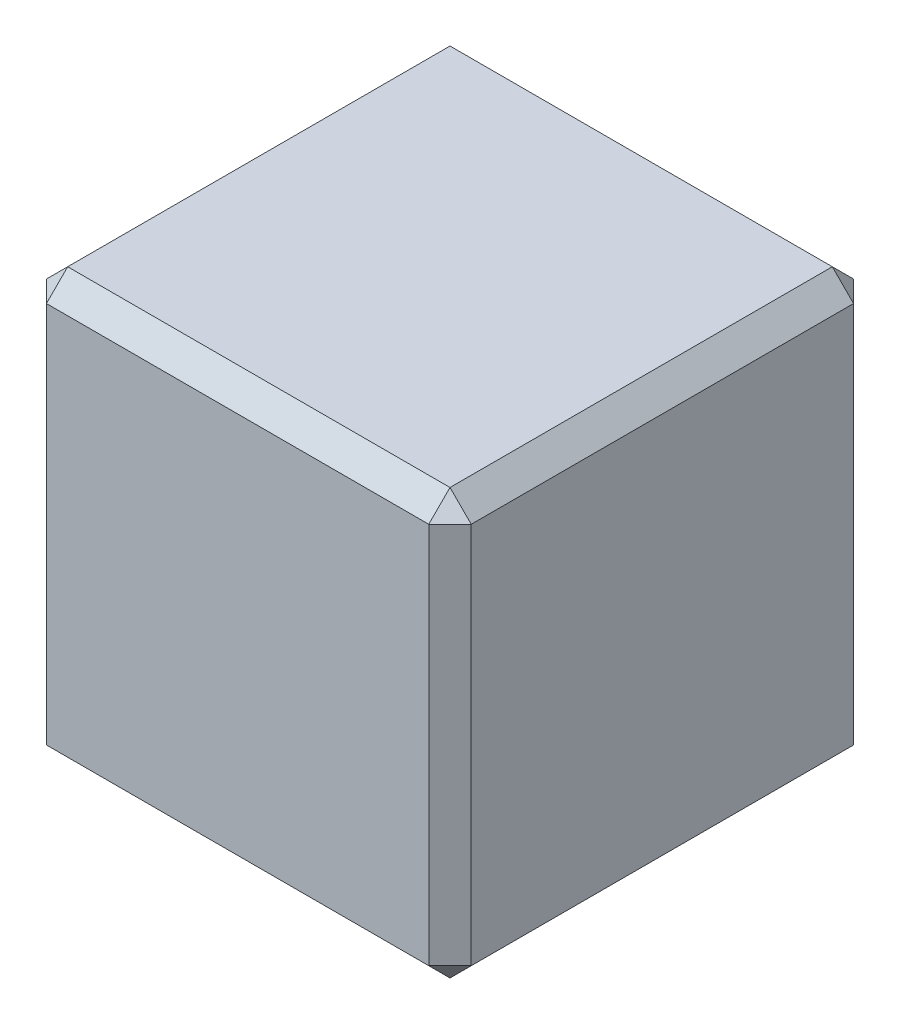
ISO-10303-21;
HEADER;
FILE_DESCRIPTION(('STEP AP214'),'2;1');
FILE_NAME('part.step','',(''),(''),'','','');
FILE_SCHEMA(('AUTOMOTIVE_DESIGN { 1 0 10303 214 1 1 1 1 }'));
ENDSEC;
DATA;
#1=APPLICATION_CONTEXT('core data for automotive mechanical design processes');
#2=APPLICATION_PROTOCOL_DEFINITION('international standard','automotive_design',2000,#1);
#3=PRODUCT_CONTEXT('',#1,'mechanical');
#4=PRODUCT('Part','Part','',(#3));
#5=PRODUCT_RELATED_PRODUCT_CATEGORY('part','',(#4));
#6=PRODUCT_DEFINITION_FORMATION('','',#4);
#7=PRODUCT_DEFINITION_CONTEXT('part definition',#1,'design');
#8=PRODUCT_DEFINITION('design','',#6,#7);
#9=PRODUCT_DEFINITION_SHAPE('','',#8);
#10=(LENGTH_UNIT() NAMED_UNIT(*) SI_UNIT(.MILLI.,.METRE.));
#11=(NAMED_UNIT(*) PLANE_ANGLE_UNIT() SI_UNIT($,.RADIAN.));
#12=(NAMED_UNIT(*) SI_UNIT($,.STERADIAN.) SOLID_ANGLE_UNIT());
#13=UNCERTAINTY_MEASURE_WITH_UNIT(LENGTH_MEASURE(1.E-05),#10,'distance_accuracy_value','');
#14=(GEOMETRIC_REPRESENTATION_CONTEXT(3) GLOBAL_UNCERTAINTY_ASSIGNED_CONTEXT((#13)) GLOBAL_UNIT_ASSIGNED_CONTEXT((#10,
#11,#12)) REPRESENTATION_CONTEXT('',''));
#15=CARTESIAN_POINT('',(0.,0.,0.));
#16=DIRECTION('',(0.,0.,1.));
#17=DIRECTION('',(1.,0.,0.));
#18=AXIS2_PLACEMENT_3D('',#15,#16,#17);
#19=CARTESIAN_POINT('',(0.,0.,20.));
#20=DIRECTION('',(1.,0.,0.));
#21=DIRECTION('',(0.,0.,-1.));
#22=AXIS2_PLACEMENT_3D('',#19,#20,#21);
#23=PLANE('',#22);
#24=DIRECTION('',(0.,-1.,0.));
#25=VECTOR('',#24,1.);
#26=CARTESIAN_POINT('',(0.,0.,0.999999999999997));
#27=LINE('',#26,#25);
#28=CARTESIAN_POINT('',(0.,19.,0.999999999999997));
#29=VERTEX_POINT('',#28);
#30=CARTESIAN_POINT('',(0.,1.,0.999999999999997));
#31=VERTEX_POINT('',#30);
#32=EDGE_CURVE('E175',#29,#31,#27,.T.);
#33=ORIENTED_EDGE('',*,*,#32,.T.);
#34=DIRECTION('',(0.,0.,1.));
#35=VECTOR('',#34,1.);
#36=CARTESIAN_POINT('',(0.,1.,20.));
#37=LINE('',#36,#35);
#38=CARTESIAN_POINT('',(0.,1.,19.));
#39=VERTEX_POINT('',#38);
#40=EDGE_CURVE('E177',#31,#39,#37,.T.);
#41=ORIENTED_EDGE('',*,*,#40,.T.);
#42=DIRECTION('',(0.,1.,0.));
#43=VECTOR('',#42,1.);
#44=CARTESIAN_POINT('',(0.,0.,19.));
#45=LINE('',#44,#43);
#46=CARTESIAN_POINT('',(0.,19.,19.));
#47=VERTEX_POINT('',#46);
#48=EDGE_CURVE('E173',#39,#47,#45,.T.);
#49=ORIENTED_EDGE('',*,*,#48,.T.);
#50=DIRECTION('',(0.,0.,-1.));
#51=VECTOR('',#50,1.);
#52=CARTESIAN_POINT('',(0.,19.,20.));
#53=LINE('',#52,#51);
#54=EDGE_CURVE('E171',#47,#29,#53,.T.);
#55=ORIENTED_EDGE('',*,*,#54,.T.);
#56=EDGE_LOOP('',(#33,#41,#49,#55));
#57=FACE_BOUND('',#56,.T.);
#58=ADVANCED_FACE('F38',(#57),#23,.F.);
#59=CARTESIAN_POINT('',(0.,0.,20.));
#60=DIRECTION('',(0.,1.,0.));
#61=DIRECTION('',(0.,0.,1.));
#62=AXIS2_PLACEMENT_3D('',#59,#60,#61);
#63=PLANE('',#62);
#64=DIRECTION('',(-1.,0.,0.));
#65=VECTOR('',#64,1.);
#66=CARTESIAN_POINT('',(0.,0.,19.));
#67=LINE('',#66,#65);
#68=CARTESIAN_POINT('',(19.,0.,19.));
#69=VERTEX_POINT('',#68);
#70=CARTESIAN_POINT('',(0.999999999999997,0.,19.));
#71=VERTEX_POINT('',#70);
#72=EDGE_CURVE('E131',#69,#71,#67,.T.);
#73=ORIENTED_EDGE('',*,*,#72,.T.);
#74=DIRECTION('',(0.,0.,-1.));
#75=VECTOR('',#74,1.);
#76=CARTESIAN_POINT('',(0.999999999999997,0.,20.));
#77=LINE('',#76,#75);
#78=CARTESIAN_POINT('',(0.999999999999997,0.,0.999999999999997));
#79=VERTEX_POINT('',#78);
#80=EDGE_CURVE('E169',#71,#79,#77,.T.);
#81=ORIENTED_EDGE('',*,*,#80,.T.);
#82=DIRECTION('',(1.,0.,0.));
#83=VECTOR('',#82,1.);
#84=CARTESIAN_POINT('',(20.,0.,0.999999999999997));
#85=LINE('',#84,#83);
#86=CARTESIAN_POINT('',(19.,0.,0.999999999999997));
#87=VERTEX_POINT('',#86);
#88=EDGE_CURVE('E134',#79,#87,#85,.T.);
#89=ORIENTED_EDGE('',*,*,#88,.T.);
#90=DIRECTION('',(0.,0.,1.));
#91=VECTOR('',#90,1.);
#92=CARTESIAN_POINT('',(19.,0.,20.));
#93=LINE('',#92,#91);
#94=EDGE_CURVE('E126',#87,#69,#93,.T.);
#95=ORIENTED_EDGE('',*,*,#94,.T.);
#96=EDGE_LOOP('',(#73,#81,#89,#95));
#97=FACE_BOUND('',#96,.T.);
#98=ADVANCED_FACE('F128',(#97),#63,.F.);
#99=CARTESIAN_POINT('',(20.,0.,20.));
#100=DIRECTION('',(-1.,0.,0.));
#101=DIRECTION('',(0.,0.,1.));
#102=AXIS2_PLACEMENT_3D('',#99,#100,#101);
#103=PLANE('',#102);
#104=DIRECTION('',(0.,-1.,0.));
#105=VECTOR('',#104,1.);
#106=CARTESIAN_POINT('',(20.,0.,19.));
#107=LINE('',#106,#105);
#108=CARTESIAN_POINT('',(20.,19.,19.));
#109=VERTEX_POINT('',#108);
#110=CARTESIAN_POINT('',(20.,0.999999999999997,19.));
#111=VERTEX_POINT('',#110);
#112=EDGE_CURVE('E191',#109,#111,#107,.T.);
#113=ORIENTED_EDGE('',*,*,#112,.T.);
#114=DIRECTION('',(0.,0.,-1.));
#115=VECTOR('',#114,1.);
#116=CARTESIAN_POINT('',(20.,0.999999999999997,20.));
#117=LINE('',#116,#115);
#118=CARTESIAN_POINT('',(20.,0.999999999999997,0.999999999999997));
#119=VERTEX_POINT('',#118);
#120=EDGE_CURVE('E145',#111,#119,#117,.T.);
#121=ORIENTED_EDGE('',*,*,#120,.T.);
#122=DIRECTION('',(0.,1.,0.));
#123=VECTOR('',#122,1.);
#124=CARTESIAN_POINT('',(20.,20.,0.999999999999997));
#125=LINE('',#124,#123);
#126=CARTESIAN_POINT('',(20.,19.,0.999999999999997));
#127=VERTEX_POINT('',#126);
#128=EDGE_CURVE('E193',#119,#127,#125,.T.);
#129=ORIENTED_EDGE('',*,*,#128,.T.);
#130=DIRECTION('',(0.,0.,1.));
#131=VECTOR('',#130,1.);
#132=CARTESIAN_POINT('',(20.,19.,20.));
#133=LINE('',#132,#131);
#134=EDGE_CURVE('E189',#127,#109,#133,.T.);
#135=ORIENTED_EDGE('',*,*,#134,.T.);
#136=EDGE_LOOP('',(#113,#121,#129,#135));
#137=FACE_BOUND('',#136,.T.);
#138=ADVANCED_FACE('F339',(#137),#103,.F.);
#139=CARTESIAN_POINT('',(0.,20.,20.));
#140=DIRECTION('',(0.,-1.,0.));
#141=DIRECTION('',(0.,0.,-1.));
#142=AXIS2_PLACEMENT_3D('',#139,#140,#141);
#143=PLANE('',#142);
#144=DIRECTION('',(1.,0.,0.));
#145=VECTOR('',#144,1.);
#146=CARTESIAN_POINT('',(0.,20.,19.));
#147=LINE('',#146,#145);
#148=CARTESIAN_POINT('',(0.999999999999997,20.,19.));
#149=VERTEX_POINT('',#148);
#150=CARTESIAN_POINT('',(19.,20.,19.));
#151=VERTEX_POINT('',#150);
#152=EDGE_CURVE('E48',#149,#151,#147,.T.);
#153=ORIENTED_EDGE('',*,*,#152,.T.);
#154=DIRECTION('',(0.,0.,-1.));
#155=VECTOR('',#154,1.);
#156=CARTESIAN_POINT('',(19.,20.,20.));
#157=LINE('',#156,#155);
#158=CARTESIAN_POINT('',(19.,20.,0.999999999999997));
#159=VERTEX_POINT('',#158);
#160=EDGE_CURVE('E11',#151,#159,#157,.T.);
#161=ORIENTED_EDGE('',*,*,#160,.T.);
#162=DIRECTION('',(-1.,0.,0.));
#163=VECTOR('',#162,1.);
#164=CARTESIAN_POINT('',(0.,20.,0.999999999999997));
#165=LINE('',#164,#163);
#166=CARTESIAN_POINT('',(0.999999999999997,20.,0.999999999999997));
#167=VERTEX_POINT('',#166);
#168=EDGE_CURVE('E205',#159,#167,#165,.T.);
#169=ORIENTED_EDGE('',*,*,#168,.T.);
#170=DIRECTION('',(0.,0.,1.));
#171=VECTOR('',#170,1.);
#172=CARTESIAN_POINT('',(0.999999999999997,20.,20.));
#173=LINE('',#172,#171);
#174=EDGE_CURVE('E59',#167,#149,#173,.T.);
#175=ORIENTED_EDGE('',*,*,#174,.T.);
#176=EDGE_LOOP('',(#153,#161,#169,#175));
#177=FACE_BOUND('',#176,.T.);
#178=ADVANCED_FACE('F278',(#177),#143,.F.);
#179=CARTESIAN_POINT('',(0.,0.,20.));
#180=DIRECTION('',(0.,0.,-1.));
#181=DIRECTION('',(-1.,0.,0.));
#182=AXIS2_PLACEMENT_3D('',#179,#180,#181);
#183=PLANE('',#182);
#184=DIRECTION('',(1.,0.,0.));
#185=VECTOR('',#184,1.);
#186=CARTESIAN_POINT('',(0.,0.999999999999997,20.));
#187=LINE('',#186,#185);
#188=CARTESIAN_POINT('',(0.999999999999997,0.999999999999997,20.));
#189=VERTEX_POINT('',#188);
#190=CARTESIAN_POINT('',(19.,0.999999999999997,20.));
#191=VERTEX_POINT('',#190);
#192=EDGE_CURVE('E200',#189,#191,#187,.T.);
#193=ORIENTED_EDGE('',*,*,#192,.T.);
#194=DIRECTION('',(0.,1.,0.));
#195=VECTOR('',#194,1.);
#196=CARTESIAN_POINT('',(19.,0.,20.));
#197=LINE('',#196,#195);
#198=CARTESIAN_POINT('',(19.,19.,20.));
#199=VERTEX_POINT('',#198);
#200=EDGE_CURVE('E202',#191,#199,#197,.T.);
#201=ORIENTED_EDGE('',*,*,#200,.T.);
#202=DIRECTION('',(-1.,0.,0.));
#203=VECTOR('',#202,1.);
#204=CARTESIAN_POINT('',(0.,19.,20.));
#205=LINE('',#204,#203);
#206=CARTESIAN_POINT('',(0.999999999999997,19.,20.));
#207=VERTEX_POINT('',#206);
#208=EDGE_CURVE('E196',#199,#207,#205,.T.);
#209=ORIENTED_EDGE('',*,*,#208,.T.);
#210=DIRECTION('',(0.,-1.,0.));
#211=VECTOR('',#210,1.);
#212=CARTESIAN_POINT('',(0.999999999999997,0.,20.));
#213=LINE('',#212,#211);
#214=EDGE_CURVE('E198',#207,#189,#213,.T.);
#215=ORIENTED_EDGE('',*,*,#214,.T.);
#216=EDGE_LOOP('',(#193,#201,#209,#215));
#217=FACE_BOUND('',#216,.T.);
#218=ADVANCED_FACE('F302',(#217),#183,.F.);
#219=CARTESIAN_POINT('',(0.,0.,0.));
#220=DIRECTION('',(0.,0.,-1.));
#221=DIRECTION('',(-1.,0.,0.));
#222=AXIS2_PLACEMENT_3D('',#219,#220,#221);
#223=PLANE('',#222);
#224=DIRECTION('',(0.,-1.,0.));
#225=VECTOR('',#224,1.);
#226=CARTESIAN_POINT('',(19.,0.,0.));
#227=LINE('',#226,#225);
#228=CARTESIAN_POINT('',(19.,19.,0.));
#229=VERTEX_POINT('',#228);
#230=CARTESIAN_POINT('',(19.,1.,0.));
#231=VERTEX_POINT('',#230);
#232=EDGE_CURVE('E182',#229,#231,#227,.T.);
#233=ORIENTED_EDGE('',*,*,#232,.T.);
#234=DIRECTION('',(-1.,0.,0.));
#235=VECTOR('',#234,1.);
#236=CARTESIAN_POINT('',(0.,1.,0.));
#237=LINE('',#236,#235);
#238=CARTESIAN_POINT('',(1.,1.,0.));
#239=VERTEX_POINT('',#238);
#240=EDGE_CURVE('E186',#231,#239,#237,.T.);
#241=ORIENTED_EDGE('',*,*,#240,.T.);
#242=DIRECTION('',(0.,1.,0.));
#243=VECTOR('',#242,1.);
#244=CARTESIAN_POINT('',(1.,20.,0.));
#245=LINE('',#244,#243);
#246=CARTESIAN_POINT('',(1.,19.,0.));
#247=VERTEX_POINT('',#246);
#248=EDGE_CURVE('E184',#239,#247,#245,.T.);
#249=ORIENTED_EDGE('',*,*,#248,.T.);
#250=DIRECTION('',(1.,0.,0.));
#251=VECTOR('',#250,1.);
#252=CARTESIAN_POINT('',(20.,19.,0.));
#253=LINE('',#252,#251);
#254=EDGE_CURVE('E180',#247,#229,#253,.T.);
#255=ORIENTED_EDGE('',*,*,#254,.T.);
#256=EDGE_LOOP('',(#233,#241,#249,#255));
#257=FACE_BOUND('',#256,.T.);
#258=ADVANCED_FACE('F271',(#257),#223,.T.);
#259=CARTESIAN_POINT('',(19.,20.,20.));
#260=DIRECTION('',(-0.70710678118655,-0.707106781186545,0.));
#261=DIRECTION('',(0.,0.,-1.));
#262=AXIS2_PLACEMENT_3D('',#259,#260,#261);
#263=PLANE('',#262);
#264=DIRECTION('',(0.707106781186545,-0.70710678118655,0.));
#265=VECTOR('',#264,1.);
#266=CARTESIAN_POINT('',(19.5,19.5,19.));
#267=LINE('',#266,#265);
#268=EDGE_CURVE('E43',#109,#151,#267,.F.);
#269=ORIENTED_EDGE('',*,*,#268,.F.);
#270=ORIENTED_EDGE('',*,*,#134,.F.);
#271=DIRECTION('',(-0.707106781186545,0.70710678118655,0.));
#272=VECTOR('',#271,1.);
#273=CARTESIAN_POINT('',(20.,19.,0.999999999999997));
#274=LINE('',#273,#272);
#275=EDGE_CURVE('E166',#159,#127,#274,.F.);
#276=ORIENTED_EDGE('',*,*,#275,.F.);
#277=ORIENTED_EDGE('',*,*,#160,.F.);
#278=EDGE_LOOP('',(#269,#270,#276,#277));
#279=FACE_BOUND('',#278,.T.);
#280=ADVANCED_FACE('F41',(#279),#263,.F.);
#281=CARTESIAN_POINT('',(19.,19.,20.));
#282=DIRECTION('',(0.57735026918963,0.577350269189622,0.577350269189626));
#283=DIRECTION('',(0.707106781186545,0.,-0.70710678118655));
#284=AXIS2_PLACEMENT_3D('',#281,#282,#283);
#285=PLANE('',#284);
#286=DIRECTION('',(-0.707106781186545,0.,0.70710678118655));
#287=VECTOR('',#286,1.);
#288=CARTESIAN_POINT('',(19.,19.,20.));
#289=LINE('',#288,#287);
#290=EDGE_CURVE('E251',#109,#199,#289,.T.);
#291=ORIENTED_EDGE('',*,*,#290,.F.);
#292=ORIENTED_EDGE('',*,*,#268,.T.);
#293=DIRECTION('',(0.,0.70710678118655,-0.707106781186545));
#294=VECTOR('',#293,1.);
#295=CARTESIAN_POINT('',(19.,19.,20.));
#296=LINE('',#295,#294);
#297=EDGE_CURVE('E254',#199,#151,#296,.T.);
#298=ORIENTED_EDGE('',*,*,#297,.F.);
#299=EDGE_LOOP('',(#291,#292,#298));
#300=FACE_BOUND('',#299,.T.);
#301=ADVANCED_FACE('F295',(#300),#285,.T.);
#302=CARTESIAN_POINT('',(20.,19.,0.999999999999997));
#303=DIRECTION('',(0.577350269189626,0.577350269189622,-0.57735026918963));
#304=DIRECTION('',(-0.70710678118655,0.,-0.707106781186545));
#305=AXIS2_PLACEMENT_3D('',#302,#303,#304);
#306=PLANE('',#305);
#307=DIRECTION('',(0.,0.70710678118655,0.707106781186545));
#308=VECTOR('',#307,1.);
#309=CARTESIAN_POINT('',(19.,19.5,0.499999999999999));
#310=LINE('',#309,#308);
#311=EDGE_CURVE('E245',#159,#229,#310,.F.);
#312=ORIENTED_EDGE('',*,*,#311,.F.);
#313=ORIENTED_EDGE('',*,*,#275,.T.);
#314=DIRECTION('',(-0.70710678118655,0.,-0.707106781186545));
#315=VECTOR('',#314,1.);
#316=CARTESIAN_POINT('',(20.,19.,0.999999999999997));
#317=LINE('',#316,#315);
#318=EDGE_CURVE('E248',#229,#127,#317,.F.);
#319=ORIENTED_EDGE('',*,*,#318,.F.);
#320=EDGE_LOOP('',(#312,#313,#319));
#321=FACE_BOUND('',#320,.T.);
#322=ADVANCED_FACE('F261',(#321),#306,.T.);
#323=CARTESIAN_POINT('',(0.,19.,20.));
#324=DIRECTION('',(0.,-0.707106781186545,-0.70710678118655));
#325=DIRECTION('',(-1.,0.,0.));
#326=AXIS2_PLACEMENT_3D('',#323,#324,#325);
#327=PLANE('',#326);
#328=ORIENTED_EDGE('',*,*,#297,.T.);
#329=ORIENTED_EDGE('',*,*,#152,.F.);
#330=DIRECTION('',(0.,-0.70710678118655,0.707106781186545));
#331=VECTOR('',#330,1.);
#332=CARTESIAN_POINT('',(0.999999999999997,19.5,19.5));
#333=LINE('',#332,#331);
#334=EDGE_CURVE('E239',#207,#149,#333,.F.);
#335=ORIENTED_EDGE('',*,*,#334,.F.);
#336=ORIENTED_EDGE('',*,*,#208,.F.);
#337=EDGE_LOOP('',(#328,#329,#335,#336));
#338=FACE_BOUND('',#337,.T.);
#339=ADVANCED_FACE('F291',(#338),#327,.F.);
#340=CARTESIAN_POINT('',(19.,0.,20.));
#341=DIRECTION('',(-0.70710678118655,0.,-0.707106781186545));
#342=DIRECTION('',(0.,1.,0.));
#343=AXIS2_PLACEMENT_3D('',#340,#341,#342);
#344=PLANE('',#343);
#345=ORIENTED_EDGE('',*,*,#290,.T.);
#346=ORIENTED_EDGE('',*,*,#200,.F.);
#347=DIRECTION('',(0.707106781186545,0.,-0.70710678118655));
#348=VECTOR('',#347,1.);
#349=CARTESIAN_POINT('',(19.5,0.999999999999997,19.5));
#350=LINE('',#349,#348);
#351=EDGE_CURVE('E149',#111,#191,#350,.F.);
#352=ORIENTED_EDGE('',*,*,#351,.F.);
#353=ORIENTED_EDGE('',*,*,#112,.F.);
#354=EDGE_LOOP('',(#345,#346,#352,#353));
#355=FACE_BOUND('',#354,.T.);
#356=ADVANCED_FACE('F300',(#355),#344,.F.);
#357=CARTESIAN_POINT('',(20.,0.999999999999997,20.));
#358=DIRECTION('',(-0.707106781186545,0.70710678118655,0.));
#359=DIRECTION('',(0.,0.,-1.));
#360=AXIS2_PLACEMENT_3D('',#357,#358,#359);
#361=PLANE('',#360);
#362=DIRECTION('',(0.70710678118655,0.707106781186545,0.));
#363=VECTOR('',#362,1.);
#364=CARTESIAN_POINT('',(19.,0.,0.999999999999997));
#365=LINE('',#364,#363);
#366=EDGE_CURVE('E150',#119,#87,#365,.F.);
#367=ORIENTED_EDGE('',*,*,#366,.F.);
#368=ORIENTED_EDGE('',*,*,#120,.F.);
#369=DIRECTION('',(-0.70710678118655,-0.707106781186545,0.));
#370=VECTOR('',#369,1.);
#371=CARTESIAN_POINT('',(19.,0.,19.));
#372=LINE('',#371,#370);
#373=EDGE_CURVE('E141',#69,#111,#372,.F.);
#374=ORIENTED_EDGE('',*,*,#373,.F.);
#375=ORIENTED_EDGE('',*,*,#94,.F.);
#376=EDGE_LOOP('',(#367,#368,#374,#375));
#377=FACE_BOUND('',#376,.T.);
#378=ADVANCED_FACE('F143',(#377),#361,.F.);
#379=CARTESIAN_POINT('',(20.,0.,0.999999999999997));
#380=DIRECTION('',(0.707106781186545,0.,-0.70710678118655));
#381=DIRECTION('',(0.,-1.,0.));
#382=AXIS2_PLACEMENT_3D('',#379,#380,#381);
#383=PLANE('',#382);
#384=ORIENTED_EDGE('',*,*,#318,.T.);
#385=ORIENTED_EDGE('',*,*,#128,.F.);
#386=DIRECTION('',(0.70710678118655,0.,0.707106781186545));
#387=VECTOR('',#386,1.);
#388=CARTESIAN_POINT('',(19.5,1.,0.499999999999999));
#389=LINE('',#388,#387);
#390=EDGE_CURVE('E235',#231,#119,#389,.T.);
#391=ORIENTED_EDGE('',*,*,#390,.F.);
#392=ORIENTED_EDGE('',*,*,#232,.F.);
#393=EDGE_LOOP('',(#384,#385,#391,#392));
#394=FACE_BOUND('',#393,.T.);
#395=ADVANCED_FACE('F267',(#394),#383,.T.);
#396=CARTESIAN_POINT('',(0.,20.,0.999999999999997));
#397=DIRECTION('',(0.,0.707106781186545,-0.70710678118655));
#398=DIRECTION('',(1.,0.,0.));
#399=AXIS2_PLACEMENT_3D('',#396,#397,#398);
#400=PLANE('',#399);
#401=ORIENTED_EDGE('',*,*,#311,.T.);
#402=ORIENTED_EDGE('',*,*,#254,.F.);
#403=DIRECTION('',(0.,-0.70710678118655,-0.707106781186545));
#404=VECTOR('',#403,1.);
#405=CARTESIAN_POINT('',(1.,19.,0.));
#406=LINE('',#405,#404);
#407=EDGE_CURVE('E232',#167,#247,#406,.T.);
#408=ORIENTED_EDGE('',*,*,#407,.F.);
#409=ORIENTED_EDGE('',*,*,#168,.F.);
#410=EDGE_LOOP('',(#401,#402,#408,#409));
#411=FACE_BOUND('',#410,.T.);
#412=ADVANCED_FACE('F277',(#411),#400,.T.);
#413=CARTESIAN_POINT('',(0.,19.,20.));
#414=DIRECTION('',(0.70710678118655,-0.707106781186545,0.));
#415=DIRECTION('',(0.,0.,-1.));
#416=AXIS2_PLACEMENT_3D('',#413,#414,#415);
#417=PLANE('',#416);
#418=DIRECTION('',(0.707106781186545,0.70710678118655,0.));
#419=VECTOR('',#418,1.);
#420=CARTESIAN_POINT('',(0.,19.,19.));
#421=LINE('',#420,#419);
#422=EDGE_CURVE('E242',#149,#47,#421,.F.);
#423=ORIENTED_EDGE('',*,*,#422,.F.);
#424=ORIENTED_EDGE('',*,*,#174,.F.);
#425=DIRECTION('',(-0.707106781186545,-0.70710678118655,0.));
#426=VECTOR('',#425,1.);
#427=CARTESIAN_POINT('',(0.499999999999999,19.5,0.999999999999997));
#428=LINE('',#427,#426);
#429=EDGE_CURVE('E229',#29,#167,#428,.F.);
#430=ORIENTED_EDGE('',*,*,#429,.F.);
#431=ORIENTED_EDGE('',*,*,#54,.F.);
#432=EDGE_LOOP('',(#423,#424,#430,#431));
#433=FACE_BOUND('',#432,.T.);
#434=ADVANCED_FACE('F282',(#433),#417,.F.);
#435=CARTESIAN_POINT('',(0.,19.,19.));
#436=DIRECTION('',(-0.57735026918963,0.577350269189622,0.577350269189626));
#437=DIRECTION('',(0.707106781186545,0.,0.70710678118655));
#438=AXIS2_PLACEMENT_3D('',#435,#436,#437);
#439=PLANE('',#438);
#440=ORIENTED_EDGE('',*,*,#334,.T.);
#441=ORIENTED_EDGE('',*,*,#422,.T.);
#442=DIRECTION('',(-0.707106781186545,0.,-0.70710678118655));
#443=VECTOR('',#442,1.);
#444=CARTESIAN_POINT('',(0.,19.,19.));
#445=LINE('',#444,#443);
#446=EDGE_CURVE('E157',#207,#47,#445,.T.);
#447=ORIENTED_EDGE('',*,*,#446,.F.);
#448=EDGE_LOOP('',(#440,#441,#447));
#449=FACE_BOUND('',#448,.T.);
#450=ADVANCED_FACE('F288',(#449),#439,.T.);
#451=CARTESIAN_POINT('',(19.,0.,19.));
#452=DIRECTION('',(0.577350269189626,-0.57735026918963,0.577350269189622));
#453=DIRECTION('',(0.70710678118655,0.707106781186545,0.));
#454=AXIS2_PLACEMENT_3D('',#451,#452,#453);
#455=PLANE('',#454);
#456=ORIENTED_EDGE('',*,*,#373,.T.);
#457=ORIENTED_EDGE('',*,*,#351,.T.);
#458=DIRECTION('',(0.,0.707106781186545,0.70710678118655));
#459=VECTOR('',#458,1.);
#460=CARTESIAN_POINT('',(19.,0.,19.));
#461=LINE('',#460,#459);
#462=EDGE_CURVE('E153',#69,#191,#461,.T.);
#463=ORIENTED_EDGE('',*,*,#462,.F.);
#464=EDGE_LOOP('',(#456,#457,#463));
#465=FACE_BOUND('',#464,.T.);
#466=ADVANCED_FACE('F154',(#465),#455,.T.);
#467=CARTESIAN_POINT('',(19.,0.,0.999999999999997));
#468=DIRECTION('',(0.577350269189622,-0.577350269189626,-0.57735026918963));
#469=DIRECTION('',(0.,0.70710678118655,-0.707106781186545));
#470=AXIS2_PLACEMENT_3D('',#467,#468,#469);
#471=PLANE('',#470);
#472=ORIENTED_EDGE('',*,*,#390,.T.);
#473=ORIENTED_EDGE('',*,*,#366,.T.);
#474=DIRECTION('',(0.,0.70710678118655,-0.707106781186545));
#475=VECTOR('',#474,1.);
#476=CARTESIAN_POINT('',(19.,0.,0.999999999999997));
#477=LINE('',#476,#475);
#478=EDGE_CURVE('E158',#231,#87,#477,.F.);
#479=ORIENTED_EDGE('',*,*,#478,.F.);
#480=EDGE_LOOP('',(#472,#473,#479));
#481=FACE_BOUND('',#480,.T.);
#482=ADVANCED_FACE('F321',(#481),#471,.T.);
#483=CARTESIAN_POINT('',(1.,19.,0.));
#484=DIRECTION('',(-0.577350269189626,0.577350269189622,-0.57735026918963));
#485=DIRECTION('',(-0.70710678118655,0.,0.707106781186545));
#486=AXIS2_PLACEMENT_3D('',#483,#484,#485);
#487=PLANE('',#486);
#488=ORIENTED_EDGE('',*,*,#429,.T.);
#489=ORIENTED_EDGE('',*,*,#407,.T.);
#490=DIRECTION('',(-0.70710678118655,0.,0.707106781186545));
#491=VECTOR('',#490,1.);
#492=CARTESIAN_POINT('',(1.,19.,0.));
#493=LINE('',#492,#491);
#494=EDGE_CURVE('E222',#29,#247,#493,.F.);
#495=ORIENTED_EDGE('',*,*,#494,.F.);
#496=EDGE_LOOP('',(#488,#489,#495));
#497=FACE_BOUND('',#496,.T.);
#498=ADVANCED_FACE('F323',(#497),#487,.T.);
#499=CARTESIAN_POINT('',(0.999999999999997,0.,20.));
#500=DIRECTION('',(0.70710678118655,0.,-0.707106781186545));
#501=DIRECTION('',(0.,-1.,0.));
#502=AXIS2_PLACEMENT_3D('',#499,#500,#501);
#503=PLANE('',#502);
#504=ORIENTED_EDGE('',*,*,#446,.T.);
#505=ORIENTED_EDGE('',*,*,#48,.F.);
#506=DIRECTION('',(0.707106781186545,0.,0.70710678118655));
#507=VECTOR('',#506,1.);
#508=CARTESIAN_POINT('',(0.,1.,19.));
#509=LINE('',#508,#507);
#510=EDGE_CURVE('E219',#189,#39,#509,.F.);
#511=ORIENTED_EDGE('',*,*,#510,.F.);
#512=ORIENTED_EDGE('',*,*,#214,.F.);
#513=EDGE_LOOP('',(#504,#505,#511,#512));
#514=FACE_BOUND('',#513,.T.);
#515=ADVANCED_FACE('F306',(#514),#503,.F.);
#516=CARTESIAN_POINT('',(0.,0.999999999999997,20.));
#517=DIRECTION('',(0.,0.70710678118655,-0.707106781186545));
#518=DIRECTION('',(1.,0.,0.));
#519=AXIS2_PLACEMENT_3D('',#516,#517,#518);
#520=PLANE('',#519);
#521=ORIENTED_EDGE('',*,*,#462,.T.);
#522=ORIENTED_EDGE('',*,*,#192,.F.);
#523=DIRECTION('',(0.,-0.707106781186545,-0.70710678118655));
#524=VECTOR('',#523,1.);
#525=CARTESIAN_POINT('',(0.999999999999997,0.499999999999999,19.5));
#526=LINE('',#525,#524);
#527=EDGE_CURVE('E162',#71,#189,#526,.F.);
#528=ORIENTED_EDGE('',*,*,#527,.F.);
#529=ORIENTED_EDGE('',*,*,#72,.F.);
#530=EDGE_LOOP('',(#521,#522,#528,#529));
#531=FACE_BOUND('',#530,.T.);
#532=ADVANCED_FACE('F160',(#531),#520,.F.);
#533=CARTESIAN_POINT('',(0.,0.,0.999999999999997));
#534=DIRECTION('',(0.,-0.707106781186545,-0.70710678118655));
#535=DIRECTION('',(-1.,0.,0.));
#536=AXIS2_PLACEMENT_3D('',#533,#534,#535);
#537=PLANE('',#536);
#538=ORIENTED_EDGE('',*,*,#478,.T.);
#539=ORIENTED_EDGE('',*,*,#88,.F.);
#540=DIRECTION('',(0.,-0.70710678118655,0.707106781186545));
#541=VECTOR('',#540,1.);
#542=CARTESIAN_POINT('',(0.999999999999997,0.,0.999999999999997));
#543=LINE('',#542,#541);
#544=EDGE_CURVE('E215',#239,#79,#543,.T.);
#545=ORIENTED_EDGE('',*,*,#544,.F.);
#546=ORIENTED_EDGE('',*,*,#240,.F.);
#547=EDGE_LOOP('',(#538,#539,#545,#546));
#548=FACE_BOUND('',#547,.T.);
#549=ADVANCED_FACE('F319',(#548),#537,.T.);
#550=CARTESIAN_POINT('',(0.,0.,0.999999999999997));
#551=DIRECTION('',(-0.707106781186545,0.,-0.70710678118655));
#552=DIRECTION('',(0.,1.,0.));
#553=AXIS2_PLACEMENT_3D('',#550,#551,#552);
#554=PLANE('',#553);
#555=ORIENTED_EDGE('',*,*,#494,.T.);
#556=ORIENTED_EDGE('',*,*,#248,.F.);
#557=DIRECTION('',(0.70710678118655,0.,-0.707106781186545));
#558=VECTOR('',#557,1.);
#559=CARTESIAN_POINT('',(0.500000000000002,1.,0.499999999999999));
#560=LINE('',#559,#558);
#561=EDGE_CURVE('E213',#31,#239,#560,.T.);
#562=ORIENTED_EDGE('',*,*,#561,.F.);
#563=ORIENTED_EDGE('',*,*,#32,.F.);
#564=EDGE_LOOP('',(#555,#556,#562,#563));
#565=FACE_BOUND('',#564,.T.);
#566=ADVANCED_FACE('F359',(#565),#554,.T.);
#567=CARTESIAN_POINT('',(0.,1.,19.));
#568=DIRECTION('',(-0.57735026918963,-0.577350269189626,0.577350269189622));
#569=DIRECTION('',(0.707106781186545,-0.70710678118655,0.));
#570=AXIS2_PLACEMENT_3D('',#567,#568,#569);
#571=PLANE('',#570);
#572=ORIENTED_EDGE('',*,*,#527,.T.);
#573=ORIENTED_EDGE('',*,*,#510,.T.);
#574=DIRECTION('',(-0.707106781186545,0.70710678118655,0.));
#575=VECTOR('',#574,1.);
#576=CARTESIAN_POINT('',(0.,1.,19.));
#577=LINE('',#576,#575);
#578=EDGE_CURVE('E211',#71,#39,#577,.T.);
#579=ORIENTED_EDGE('',*,*,#578,.F.);
#580=EDGE_LOOP('',(#572,#573,#579));
#581=FACE_BOUND('',#580,.T.);
#582=ADVANCED_FACE('F308',(#581),#571,.T.);
#583=CARTESIAN_POINT('',(0.999999999999997,0.,0.999999999999997));
#584=DIRECTION('',(-0.577350269189626,-0.577350269189622,-0.57735026918963));
#585=DIRECTION('',(-0.70710678118655,0.,0.707106781186545));
#586=AXIS2_PLACEMENT_3D('',#583,#584,#585);
#587=PLANE('',#586);
#588=ORIENTED_EDGE('',*,*,#561,.T.);
#589=ORIENTED_EDGE('',*,*,#544,.T.);
#590=DIRECTION('',(0.707106781186545,-0.70710678118655,0.));
#591=VECTOR('',#590,1.);
#592=CARTESIAN_POINT('',(0.999999999999997,0.,0.999999999999997));
#593=LINE('',#592,#591);
#594=EDGE_CURVE('E209',#31,#79,#593,.T.);
#595=ORIENTED_EDGE('',*,*,#594,.F.);
#596=EDGE_LOOP('',(#588,#589,#595));
#597=FACE_BOUND('',#596,.T.);
#598=ADVANCED_FACE('F316',(#597),#587,.T.);
#599=CARTESIAN_POINT('',(0.999999999999997,0.,20.));
#600=DIRECTION('',(0.70710678118655,0.707106781186545,0.));
#601=DIRECTION('',(0.,0.,-1.));
#602=AXIS2_PLACEMENT_3D('',#599,#600,#601);
#603=PLANE('',#602);
#604=ORIENTED_EDGE('',*,*,#578,.T.);
#605=ORIENTED_EDGE('',*,*,#40,.F.);
#606=ORIENTED_EDGE('',*,*,#594,.T.);
#607=ORIENTED_EDGE('',*,*,#80,.F.);
#608=EDGE_LOOP('',(#604,#605,#606,#607));
#609=FACE_BOUND('',#608,.T.);
#610=ADVANCED_FACE('F312',(#609),#603,.F.);
#611=CLOSED_SHELL('',(#58,#98,#138,#178,#218,#258,#280,#301,#322,#339,#356,#378,#395,#412,#434,
#450,#466,#482,#498,#515,#532,#549,#566,#582,#598,#610));
#612=MANIFOLD_SOLID_BREP('B2',#611);
#613=ADVANCED_BREP_SHAPE_REPRESENTATION('',(#18,#612),#14);
#614=SHAPE_DEFINITION_REPRESENTATION(#9,#613);
ENDSEC;
END-ISO-10303-21;
